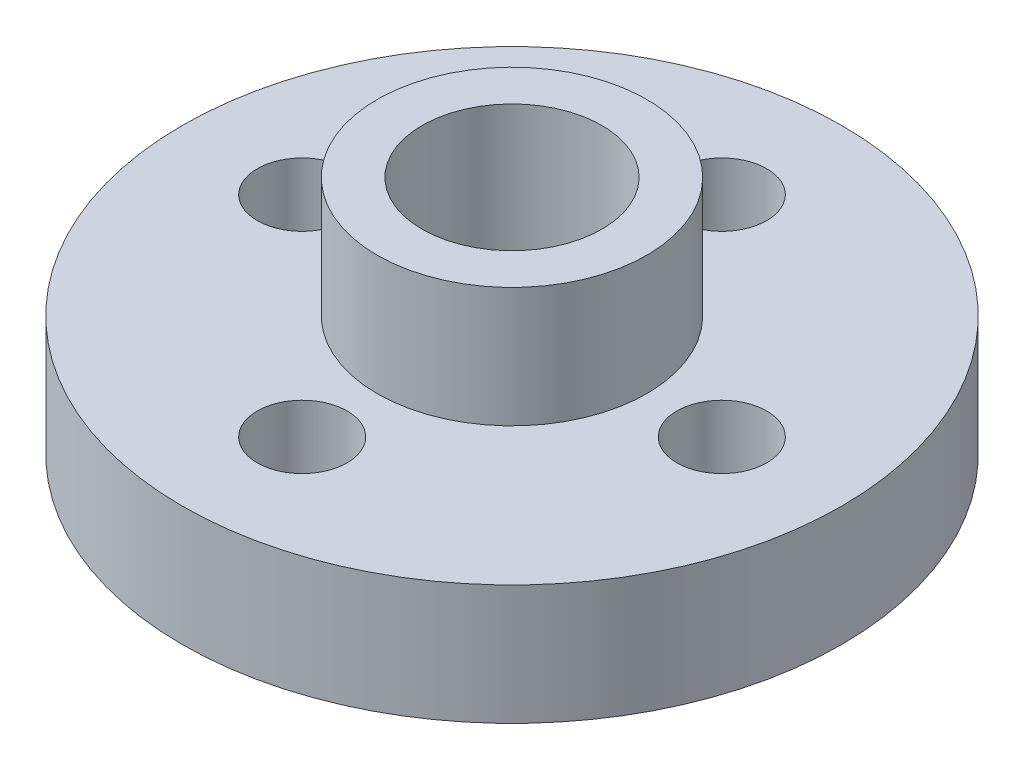
ISO-10303-21;
HEADER;
FILE_DESCRIPTION(('STEP AP214'),'2;1');
FILE_NAME('part.step','',(''),(''),'','','');
FILE_SCHEMA(('AUTOMOTIVE_DESIGN { 1 0 10303 214 1 1 1 1 }'));
ENDSEC;
DATA;
#1=APPLICATION_CONTEXT('core data for automotive mechanical design processes');
#2=APPLICATION_PROTOCOL_DEFINITION('international standard','automotive_design',2000,#1);
#3=PRODUCT_CONTEXT('',#1,'mechanical');
#4=PRODUCT('Part','Part','',(#3));
#5=PRODUCT_RELATED_PRODUCT_CATEGORY('part','',(#4));
#6=PRODUCT_DEFINITION_FORMATION('','',#4);
#7=PRODUCT_DEFINITION_CONTEXT('part definition',#1,'design');
#8=PRODUCT_DEFINITION('design','',#6,#7);
#9=PRODUCT_DEFINITION_SHAPE('','',#8);
#10=(LENGTH_UNIT() NAMED_UNIT(*) SI_UNIT(.MILLI.,.METRE.));
#11=(NAMED_UNIT(*) PLANE_ANGLE_UNIT() SI_UNIT($,.RADIAN.));
#12=(NAMED_UNIT(*) SI_UNIT($,.STERADIAN.) SOLID_ANGLE_UNIT());
#13=UNCERTAINTY_MEASURE_WITH_UNIT(LENGTH_MEASURE(1.E-05),#10,'distance_accuracy_value','');
#14=(GEOMETRIC_REPRESENTATION_CONTEXT(3) GLOBAL_UNCERTAINTY_ASSIGNED_CONTEXT((#13)) GLOBAL_UNIT_ASSIGNED_CONTEXT((#10,
#11,#12)) REPRESENTATION_CONTEXT('',''));
#15=CARTESIAN_POINT('',(0.,0.,0.));
#16=DIRECTION('',(0.,0.,1.));
#17=DIRECTION('',(1.,0.,0.));
#18=AXIS2_PLACEMENT_3D('',#15,#16,#17);
#19=CARTESIAN_POINT('',(0.,8.,0.));
#20=DIRECTION('',(0.,-1.,0.));
#21=DIRECTION('',(0.,0.,-1.));
#22=AXIS2_PLACEMENT_3D('',#19,#20,#21);
#23=CYLINDRICAL_SURFACE('',#22,11.);
#24=CARTESIAN_POINT('',(0.,0.,0.));
#25=DIRECTION('',(0.,1.,0.));
#26=DIRECTION('',(0.,0.,1.));
#27=AXIS2_PLACEMENT_3D('',#24,#25,#26);
#28=CIRCLE('',#27,11.);
#29=CARTESIAN_POINT('',(0.,0.,11.));
#30=VERTEX_POINT('',#29);
#31=EDGE_CURVE('E10',#30,#30,#28,.T.);
#32=ORIENTED_EDGE('',*,*,#31,.T.);
#33=EDGE_LOOP('',(#32));
#34=FACE_BOUND('',#33,.T.);
#35=CARTESIAN_POINT('',(0.,4.,0.));
#36=DIRECTION('',(0.,1.,0.));
#37=DIRECTION('',(0.,0.,1.));
#38=AXIS2_PLACEMENT_3D('',#35,#36,#37);
#39=CIRCLE('',#38,11.);
#40=CARTESIAN_POINT('',(0.,4.,11.));
#41=VERTEX_POINT('',#40);
#42=EDGE_CURVE('E79',#41,#41,#39,.T.);
#43=ORIENTED_EDGE('',*,*,#42,.F.);
#44=EDGE_LOOP('',(#43));
#45=FACE_BOUND('',#44,.T.);
#46=ADVANCED_FACE('F31',(#34,#45),#23,.T.);
#47=CARTESIAN_POINT('',(0.,8.,0.));
#48=DIRECTION('',(0.,1.,0.));
#49=DIRECTION('',(0.,0.,1.));
#50=AXIS2_PLACEMENT_3D('',#47,#48,#49);
#51=PLANE('',#50);
#52=CARTESIAN_POINT('',(0.,8.,0.));
#53=DIRECTION('',(0.,1.,0.));
#54=DIRECTION('',(0.,0.,1.));
#55=AXIS2_PLACEMENT_3D('',#52,#53,#54);
#56=CIRCLE('',#55,3.);
#57=CARTESIAN_POINT('',(0.,8.,3.));
#58=VERTEX_POINT('',#57);
#59=EDGE_CURVE('E46',#58,#58,#56,.T.);
#60=ORIENTED_EDGE('',*,*,#59,.F.);
#61=EDGE_LOOP('',(#60));
#62=FACE_BOUND('',#61,.T.);
#63=CARTESIAN_POINT('',(0.,8.,0.));
#64=DIRECTION('',(0.,1.,0.));
#65=DIRECTION('',(0.,0.,1.));
#66=AXIS2_PLACEMENT_3D('',#63,#64,#65);
#67=CIRCLE('',#66,4.5);
#68=CARTESIAN_POINT('',(0.,8.,4.5));
#69=VERTEX_POINT('',#68);
#70=EDGE_CURVE('E98',#69,#69,#67,.T.);
#71=ORIENTED_EDGE('',*,*,#70,.T.);
#72=EDGE_LOOP('',(#71));
#73=FACE_BOUND('',#72,.T.);
#74=ADVANCED_FACE('F91',(#62,#73),#51,.T.);
#75=CARTESIAN_POINT('',(0.,-4.00000000000001,7.));
#76=DIRECTION('',(0.,1.,0.));
#77=DIRECTION('',(0.,0.,1.));
#78=AXIS2_PLACEMENT_3D('',#75,#76,#77);
#79=CYLINDRICAL_SURFACE('',#78,1.5);
#80=CARTESIAN_POINT('',(0.,0.,7.));
#81=DIRECTION('',(0.,1.,0.));
#82=DIRECTION('',(0.,0.,1.));
#83=AXIS2_PLACEMENT_3D('',#80,#81,#82);
#84=CIRCLE('',#83,1.5);
#85=CARTESIAN_POINT('',(0.,0.,8.5));
#86=VERTEX_POINT('',#85);
#87=EDGE_CURVE('E51',#86,#86,#84,.T.);
#88=ORIENTED_EDGE('',*,*,#87,.F.);
#89=EDGE_LOOP('',(#88));
#90=FACE_BOUND('',#89,.T.);
#91=CARTESIAN_POINT('',(0.,4.,7.));
#92=DIRECTION('',(0.,1.,0.));
#93=DIRECTION('',(0.,0.,1.));
#94=AXIS2_PLACEMENT_3D('',#91,#92,#93);
#95=CIRCLE('',#94,1.5);
#96=CARTESIAN_POINT('',(0.,4.,8.5));
#97=VERTEX_POINT('',#96);
#98=EDGE_CURVE('E76',#97,#97,#95,.F.);
#99=ORIENTED_EDGE('',*,*,#98,.F.);
#100=EDGE_LOOP('',(#99));
#101=FACE_BOUND('',#100,.T.);
#102=ADVANCED_FACE('F94',(#90,#101),#79,.F.);
#103=CARTESIAN_POINT('',(7.,-4.00000000000001,0.));
#104=DIRECTION('',(0.,1.,0.));
#105=DIRECTION('',(0.,0.,1.));
#106=AXIS2_PLACEMENT_3D('',#103,#104,#105);
#107=CYLINDRICAL_SURFACE('',#106,1.5);
#108=CARTESIAN_POINT('',(7.,0.,0.));
#109=DIRECTION('',(0.,1.,0.));
#110=DIRECTION('',(0.,0.,1.));
#111=AXIS2_PLACEMENT_3D('',#108,#109,#110);
#112=CIRCLE('',#111,1.5);
#113=CARTESIAN_POINT('',(7.,0.,1.5));
#114=VERTEX_POINT('',#113);
#115=EDGE_CURVE('E54',#114,#114,#112,.T.);
#116=ORIENTED_EDGE('',*,*,#115,.F.);
#117=EDGE_LOOP('',(#116));
#118=FACE_BOUND('',#117,.T.);
#119=CARTESIAN_POINT('',(7.,4.,0.));
#120=DIRECTION('',(0.,1.,0.));
#121=DIRECTION('',(0.,0.,1.));
#122=AXIS2_PLACEMENT_3D('',#119,#120,#121);
#123=CIRCLE('',#122,1.5);
#124=CARTESIAN_POINT('',(7.,4.,1.5));
#125=VERTEX_POINT('',#124);
#126=EDGE_CURVE('E73',#125,#125,#123,.F.);
#127=ORIENTED_EDGE('',*,*,#126,.F.);
#128=EDGE_LOOP('',(#127));
#129=FACE_BOUND('',#128,.T.);
#130=ADVANCED_FACE('F67',(#118,#129),#107,.F.);
#131=CARTESIAN_POINT('',(0.,-4.00000000000001,-7.));
#132=DIRECTION('',(0.,1.,0.));
#133=DIRECTION('',(0.,0.,1.));
#134=AXIS2_PLACEMENT_3D('',#131,#132,#133);
#135=CYLINDRICAL_SURFACE('',#134,1.5);
#136=CARTESIAN_POINT('',(0.,0.,-7.));
#137=DIRECTION('',(0.,1.,0.));
#138=DIRECTION('',(0.,0.,1.));
#139=AXIS2_PLACEMENT_3D('',#136,#137,#138);
#140=CIRCLE('',#139,1.5);
#141=CARTESIAN_POINT('',(0.,0.,-5.5));
#142=VERTEX_POINT('',#141);
#143=EDGE_CURVE('E43',#142,#142,#140,.T.);
#144=ORIENTED_EDGE('',*,*,#143,.F.);
#145=EDGE_LOOP('',(#144));
#146=FACE_BOUND('',#145,.T.);
#147=CARTESIAN_POINT('',(0.,4.,-7.));
#148=DIRECTION('',(0.,1.,0.));
#149=DIRECTION('',(0.,0.,1.));
#150=AXIS2_PLACEMENT_3D('',#147,#148,#149);
#151=CIRCLE('',#150,1.5);
#152=CARTESIAN_POINT('',(0.,4.,-5.5));
#153=VERTEX_POINT('',#152);
#154=EDGE_CURVE('E71',#153,#153,#151,.F.);
#155=ORIENTED_EDGE('',*,*,#154,.F.);
#156=EDGE_LOOP('',(#155));
#157=FACE_BOUND('',#156,.T.);
#158=ADVANCED_FACE('F63',(#146,#157),#135,.F.);
#159=CARTESIAN_POINT('',(-7.,-4.00000000000001,0.));
#160=DIRECTION('',(0.,1.,0.));
#161=DIRECTION('',(0.,0.,1.));
#162=AXIS2_PLACEMENT_3D('',#159,#160,#161);
#163=CYLINDRICAL_SURFACE('',#162,1.5);
#164=CARTESIAN_POINT('',(-7.,0.,0.));
#165=DIRECTION('',(0.,1.,0.));
#166=DIRECTION('',(0.,0.,1.));
#167=AXIS2_PLACEMENT_3D('',#164,#165,#166);
#168=CIRCLE('',#167,1.5);
#169=CARTESIAN_POINT('',(-7.,0.,1.5));
#170=VERTEX_POINT('',#169);
#171=EDGE_CURVE('E38',#170,#170,#168,.T.);
#172=ORIENTED_EDGE('',*,*,#171,.F.);
#173=EDGE_LOOP('',(#172));
#174=FACE_BOUND('',#173,.T.);
#175=CARTESIAN_POINT('',(-7.,4.,0.));
#176=DIRECTION('',(0.,1.,0.));
#177=DIRECTION('',(0.,0.,1.));
#178=AXIS2_PLACEMENT_3D('',#175,#176,#177);
#179=CIRCLE('',#178,1.5);
#180=CARTESIAN_POINT('',(-7.,4.,1.5));
#181=VERTEX_POINT('',#180);
#182=EDGE_CURVE('E34',#181,#181,#179,.F.);
#183=ORIENTED_EDGE('',*,*,#182,.F.);
#184=EDGE_LOOP('',(#183));
#185=FACE_BOUND('',#184,.T.);
#186=ADVANCED_FACE('F66',(#174,#185),#163,.F.);
#187=CARTESIAN_POINT('',(0.,0.,0.));
#188=DIRECTION('',(0.,1.,0.));
#189=DIRECTION('',(0.,0.,1.));
#190=AXIS2_PLACEMENT_3D('',#187,#188,#189);
#191=PLANE('',#190);
#192=ORIENTED_EDGE('',*,*,#171,.T.);
#193=EDGE_LOOP('',(#192));
#194=FACE_BOUND('',#193,.T.);
#195=ORIENTED_EDGE('',*,*,#143,.T.);
#196=EDGE_LOOP('',(#195));
#197=FACE_BOUND('',#196,.T.);
#198=ORIENTED_EDGE('',*,*,#115,.T.);
#199=EDGE_LOOP('',(#198));
#200=FACE_BOUND('',#199,.T.);
#201=ORIENTED_EDGE('',*,*,#87,.T.);
#202=EDGE_LOOP('',(#201));
#203=FACE_BOUND('',#202,.T.);
#204=CARTESIAN_POINT('',(0.,0.,0.));
#205=DIRECTION('',(0.,1.,0.));
#206=DIRECTION('',(0.,0.,1.));
#207=AXIS2_PLACEMENT_3D('',#204,#205,#206);
#208=CIRCLE('',#207,3.);
#209=CARTESIAN_POINT('',(0.,0.,3.));
#210=VERTEX_POINT('',#209);
#211=EDGE_CURVE('E48',#210,#210,#208,.T.);
#212=ORIENTED_EDGE('',*,*,#211,.T.);
#213=EDGE_LOOP('',(#212));
#214=FACE_BOUND('',#213,.T.);
#215=ORIENTED_EDGE('',*,*,#31,.F.);
#216=EDGE_LOOP('',(#215));
#217=FACE_BOUND('',#216,.T.);
#218=ADVANCED_FACE('F60',(#194,#197,#200,#203,#214,#217),#191,.F.);
#219=CARTESIAN_POINT('',(0.,-4.00000000000001,0.));
#220=DIRECTION('',(0.,1.,0.));
#221=DIRECTION('',(0.,0.,1.));
#222=AXIS2_PLACEMENT_3D('',#219,#220,#221);
#223=CYLINDRICAL_SURFACE('',#222,3.);
#224=ORIENTED_EDGE('',*,*,#59,.T.);
#225=EDGE_LOOP('',(#224));
#226=FACE_BOUND('',#225,.T.);
#227=ORIENTED_EDGE('',*,*,#211,.F.);
#228=EDGE_LOOP('',(#227));
#229=FACE_BOUND('',#228,.T.);
#230=ADVANCED_FACE('F88',(#226,#229),#223,.F.);
#231=CARTESIAN_POINT('',(0.,4.,0.));
#232=DIRECTION('',(0.,1.,0.));
#233=DIRECTION('',(0.,0.,1.));
#234=AXIS2_PLACEMENT_3D('',#231,#232,#233);
#235=PLANE('',#234);
#236=CARTESIAN_POINT('',(0.,4.,0.));
#237=DIRECTION('',(0.,1.,0.));
#238=DIRECTION('',(0.,0.,1.));
#239=AXIS2_PLACEMENT_3D('',#236,#237,#238);
#240=CIRCLE('',#239,4.5);
#241=CARTESIAN_POINT('',(0.,4.,4.5));
#242=VERTEX_POINT('',#241);
#243=EDGE_CURVE('E100',#242,#242,#240,.T.);
#244=ORIENTED_EDGE('',*,*,#243,.F.);
#245=EDGE_LOOP('',(#244));
#246=FACE_BOUND('',#245,.T.);
#247=ORIENTED_EDGE('',*,*,#42,.T.);
#248=EDGE_LOOP('',(#247));
#249=FACE_BOUND('',#248,.T.);
#250=ORIENTED_EDGE('',*,*,#182,.T.);
#251=EDGE_LOOP('',(#250));
#252=FACE_BOUND('',#251,.T.);
#253=ORIENTED_EDGE('',*,*,#154,.T.);
#254=EDGE_LOOP('',(#253));
#255=FACE_BOUND('',#254,.T.);
#256=ORIENTED_EDGE('',*,*,#126,.T.);
#257=EDGE_LOOP('',(#256));
#258=FACE_BOUND('',#257,.T.);
#259=ORIENTED_EDGE('',*,*,#98,.T.);
#260=EDGE_LOOP('',(#259));
#261=FACE_BOUND('',#260,.T.);
#262=ADVANCED_FACE('F108',(#246,#249,#252,#255,#258,#261),#235,.T.);
#263=CARTESIAN_POINT('',(0.,4.,0.));
#264=DIRECTION('',(0.,1.,0.));
#265=DIRECTION('',(0.,0.,1.));
#266=AXIS2_PLACEMENT_3D('',#263,#264,#265);
#267=CYLINDRICAL_SURFACE('',#266,4.5);
#268=ORIENTED_EDGE('',*,*,#243,.T.);
#269=EDGE_LOOP('',(#268));
#270=FACE_BOUND('',#269,.T.);
#271=ORIENTED_EDGE('',*,*,#70,.F.);
#272=EDGE_LOOP('',(#271));
#273=FACE_BOUND('',#272,.T.);
#274=ADVANCED_FACE('F161',(#270,#273),#267,.T.);
#275=CLOSED_SHELL('',(#46,#74,#102,#130,#158,#186,#218,#230,#262,#274));
#276=MANIFOLD_SOLID_BREP('B2',#275);
#277=ADVANCED_BREP_SHAPE_REPRESENTATION('',(#18,#276),#14);
#278=SHAPE_DEFINITION_REPRESENTATION(#9,#277);
ENDSEC;
END-ISO-10303-21;
